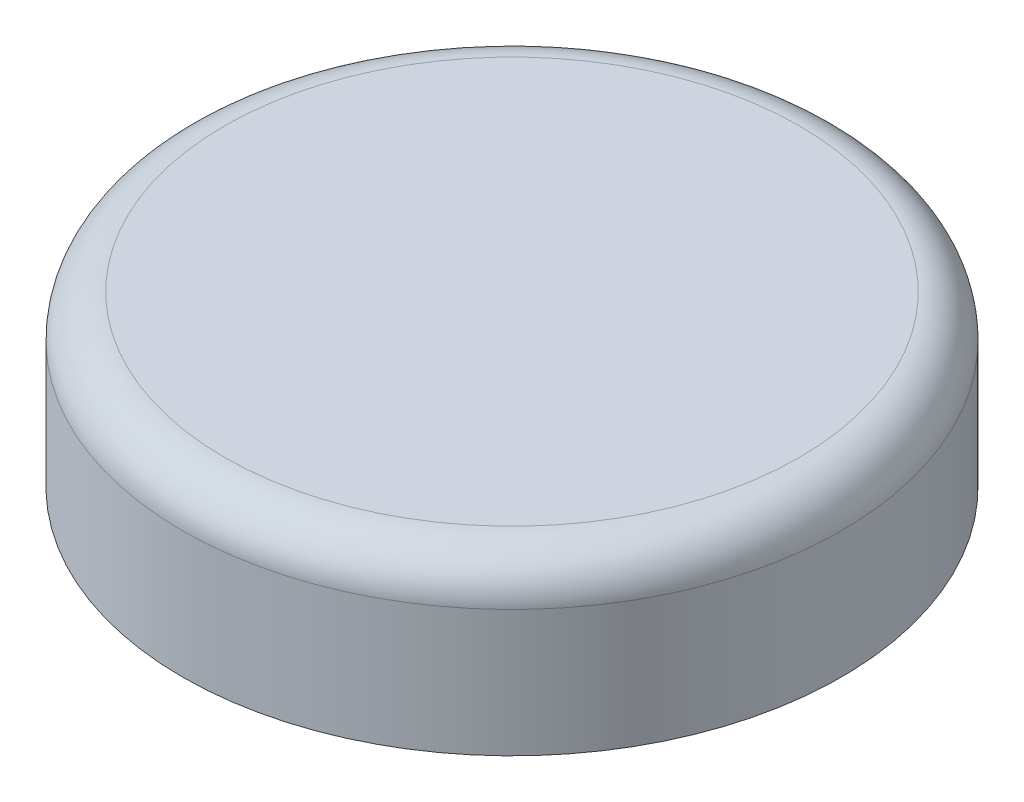
ISO-10303-21;
HEADER;
FILE_DESCRIPTION(('STEP AP214'),'2;1');
FILE_NAME('part.step','',(''),(''),'','','');
FILE_SCHEMA(('AUTOMOTIVE_DESIGN { 1 0 10303 214 1 1 1 1 }'));
ENDSEC;
DATA;
#1=APPLICATION_CONTEXT('core data for automotive mechanical design processes');
#2=APPLICATION_PROTOCOL_DEFINITION('international standard','automotive_design',2000,#1);
#3=PRODUCT_CONTEXT('',#1,'mechanical');
#4=PRODUCT('Part','Part','',(#3));
#5=PRODUCT_RELATED_PRODUCT_CATEGORY('part','',(#4));
#6=PRODUCT_DEFINITION_FORMATION('','',#4);
#7=PRODUCT_DEFINITION_CONTEXT('part definition',#1,'design');
#8=PRODUCT_DEFINITION('design','',#6,#7);
#9=PRODUCT_DEFINITION_SHAPE('','',#8);
#10=(LENGTH_UNIT() NAMED_UNIT(*) SI_UNIT(.MILLI.,.METRE.));
#11=(NAMED_UNIT(*) PLANE_ANGLE_UNIT() SI_UNIT($,.RADIAN.));
#12=(NAMED_UNIT(*) SI_UNIT($,.STERADIAN.) SOLID_ANGLE_UNIT());
#13=UNCERTAINTY_MEASURE_WITH_UNIT(LENGTH_MEASURE(1.E-05),#10,'distance_accuracy_value','');
#14=(GEOMETRIC_REPRESENTATION_CONTEXT(3) GLOBAL_UNCERTAINTY_ASSIGNED_CONTEXT((#13)) GLOBAL_UNIT_ASSIGNED_CONTEXT((#10,
#11,#12)) REPRESENTATION_CONTEXT('',''));
#15=CARTESIAN_POINT('',(0.,0.,0.));
#16=DIRECTION('',(0.,0.,1.));
#17=DIRECTION('',(1.,0.,0.));
#18=AXIS2_PLACEMENT_3D('',#15,#16,#17);
#19=CARTESIAN_POINT('',(0.,2.,0.));
#20=DIRECTION('',(0.,-1.,0.));
#21=DIRECTION('',(0.,0.,-1.));
#22=AXIS2_PLACEMENT_3D('',#19,#20,#21);
#23=CYLINDRICAL_SURFACE('',#22,3.9);
#24=CARTESIAN_POINT('',(0.,1.5,0.));
#25=DIRECTION('',(0.,1.,0.));
#26=DIRECTION('',(0.,0.,1.));
#27=AXIS2_PLACEMENT_3D('',#24,#25,#26);
#28=CIRCLE('',#27,3.9);
#29=CARTESIAN_POINT('',(0.,1.5,3.9));
#30=VERTEX_POINT('',#29);
#31=EDGE_CURVE('E10',#30,#30,#28,.F.);
#32=ORIENTED_EDGE('',*,*,#31,.T.);
#33=EDGE_LOOP('',(#32));
#34=FACE_BOUND('',#33,.T.);
#35=CARTESIAN_POINT('',(0.,0.,0.));
#36=DIRECTION('',(0.,1.,0.));
#37=DIRECTION('',(0.,0.,1.));
#38=AXIS2_PLACEMENT_3D('',#35,#36,#37);
#39=CIRCLE('',#38,3.9);
#40=CARTESIAN_POINT('',(0.,0.,3.9));
#41=VERTEX_POINT('',#40);
#42=EDGE_CURVE('E53',#41,#41,#39,.T.);
#43=ORIENTED_EDGE('',*,*,#42,.T.);
#44=EDGE_LOOP('',(#43));
#45=FACE_BOUND('',#44,.T.);
#46=ADVANCED_FACE('F40',(#34,#45),#23,.T.);
#47=CARTESIAN_POINT('',(0.,2.,0.));
#48=DIRECTION('',(0.,1.,0.));
#49=DIRECTION('',(0.,0.,1.));
#50=AXIS2_PLACEMENT_3D('',#47,#48,#49);
#51=PLANE('',#50);
#52=CARTESIAN_POINT('',(0.,2.,0.));
#53=DIRECTION('',(0.,1.,0.));
#54=DIRECTION('',(0.,0.,1.));
#55=AXIS2_PLACEMENT_3D('',#52,#53,#54);
#56=CIRCLE('',#55,3.4);
#57=CARTESIAN_POINT('',(0.,2.,3.4));
#58=VERTEX_POINT('',#57);
#59=EDGE_CURVE('E48',#58,#58,#56,.T.);
#60=ORIENTED_EDGE('',*,*,#59,.T.);
#61=EDGE_LOOP('',(#60));
#62=FACE_BOUND('',#61,.T.);
#63=ADVANCED_FACE('F64',(#62),#51,.T.);
#64=CARTESIAN_POINT('',(0.,0.,0.));
#65=DIRECTION('',(0.,1.,0.));
#66=DIRECTION('',(0.,0.,1.));
#67=AXIS2_PLACEMENT_3D('',#64,#65,#66);
#68=PLANE('',#67);
#69=ORIENTED_EDGE('',*,*,#42,.F.);
#70=EDGE_LOOP('',(#69));
#71=FACE_BOUND('',#70,.T.);
#72=ADVANCED_FACE('F62',(#71),#68,.F.);
#73=CARTESIAN_POINT('',(0.,1.5,0.));
#74=DIRECTION('',(0.,1.,0.));
#75=DIRECTION('',(0.,0.,1.));
#76=AXIS2_PLACEMENT_3D('',#73,#74,#75);
#77=TOROIDAL_SURFACE('',#76,3.4,0.5);
#78=ORIENTED_EDGE('',*,*,#31,.F.);
#79=EDGE_LOOP('',(#78));
#80=FACE_BOUND('',#79,.T.);
#81=ORIENTED_EDGE('',*,*,#59,.F.);
#82=EDGE_LOOP('',(#81));
#83=FACE_BOUND('',#82,.T.);
#84=ADVANCED_FACE('F42',(#80,#83),#77,.T.);
#85=CLOSED_SHELL('',(#46,#63,#72,#84));
#86=MANIFOLD_SOLID_BREP('B2',#85);
#87=ADVANCED_BREP_SHAPE_REPRESENTATION('',(#18,#86),#14);
#88=SHAPE_DEFINITION_REPRESENTATION(#9,#87);
ENDSEC;
END-ISO-10303-21;
